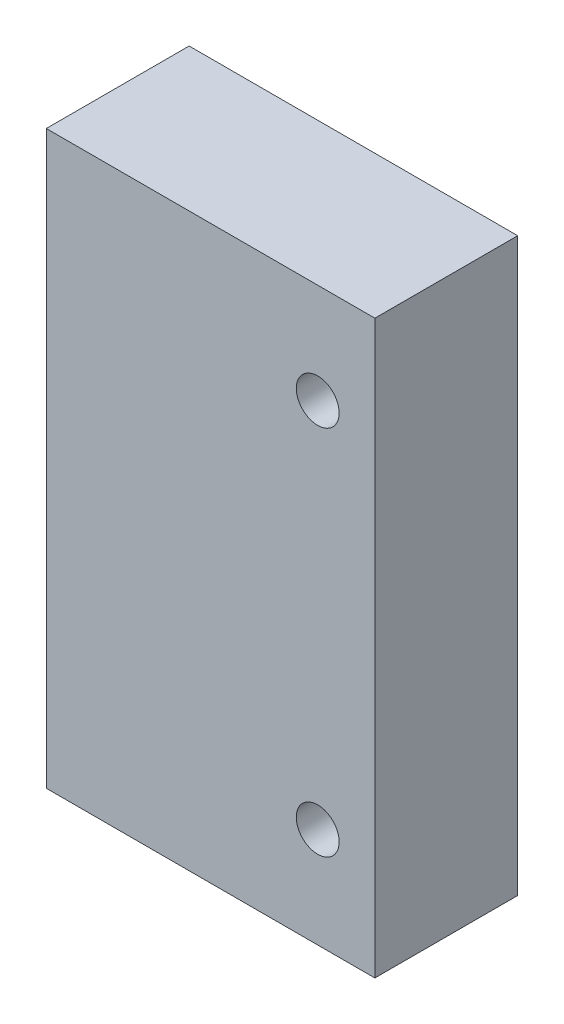
ISO-10303-21;
HEADER;
FILE_DESCRIPTION(('STEP AP214'),'2;1');
FILE_NAME('part.step','',(''),(''),'','','');
FILE_SCHEMA(('AUTOMOTIVE_DESIGN { 1 0 10303 214 1 1 1 1 }'));
ENDSEC;
DATA;
#1=APPLICATION_CONTEXT('core data for automotive mechanical design processes');
#2=APPLICATION_PROTOCOL_DEFINITION('international standard','automotive_design',2000,#1);
#3=PRODUCT_CONTEXT('',#1,'mechanical');
#4=PRODUCT('Part','Part','',(#3));
#5=PRODUCT_RELATED_PRODUCT_CATEGORY('part','',(#4));
#6=PRODUCT_DEFINITION_FORMATION('','',#4);
#7=PRODUCT_DEFINITION_CONTEXT('part definition',#1,'design');
#8=PRODUCT_DEFINITION('design','',#6,#7);
#9=PRODUCT_DEFINITION_SHAPE('','',#8);
#10=(LENGTH_UNIT() NAMED_UNIT(*) SI_UNIT(.MILLI.,.METRE.));
#11=(NAMED_UNIT(*) PLANE_ANGLE_UNIT() SI_UNIT($,.RADIAN.));
#12=(NAMED_UNIT(*) SI_UNIT($,.STERADIAN.) SOLID_ANGLE_UNIT());
#13=UNCERTAINTY_MEASURE_WITH_UNIT(LENGTH_MEASURE(1.E-05),#10,'distance_accuracy_value','');
#14=(GEOMETRIC_REPRESENTATION_CONTEXT(3) GLOBAL_UNCERTAINTY_ASSIGNED_CONTEXT((#13)) GLOBAL_UNIT_ASSIGNED_CONTEXT((#10,
#11,#12)) REPRESENTATION_CONTEXT('',''));
#15=CARTESIAN_POINT('',(0.,0.,0.));
#16=DIRECTION('',(0.,0.,1.));
#17=DIRECTION('',(1.,0.,0.));
#18=AXIS2_PLACEMENT_3D('',#15,#16,#17);
#19=CARTESIAN_POINT('',(0.,0.,10.));
#20=DIRECTION('',(0.,0.,1.));
#21=DIRECTION('',(1.,0.,0.));
#22=AXIS2_PLACEMENT_3D('',#19,#20,#21);
#23=PLANE('',#22);
#24=CARTESIAN_POINT('',(7.5,13.,10.));
#25=DIRECTION('',(0.,0.,1.));
#26=DIRECTION('',(1.,0.,0.));
#27=AXIS2_PLACEMENT_3D('',#24,#25,#26);
#28=CIRCLE('',#27,1.5);
#29=CARTESIAN_POINT('',(9.,13.,10.));
#30=VERTEX_POINT('',#29);
#31=EDGE_CURVE('E112',#30,#30,#28,.T.);
#32=ORIENTED_EDGE('',*,*,#31,.F.);
#33=EDGE_LOOP('',(#32));
#34=FACE_BOUND('',#33,.T.);
#35=DIRECTION('',(0.,1.,0.));
#36=VECTOR('',#35,1.);
#37=CARTESIAN_POINT('',(11.5,20.,10.));
#38=LINE('',#37,#36);
#39=CARTESIAN_POINT('',(11.5,-20.,10.));
#40=VERTEX_POINT('',#39);
#41=CARTESIAN_POINT('',(11.5,20.,10.));
#42=VERTEX_POINT('',#41);
#43=EDGE_CURVE('E92',#40,#42,#38,.T.);
#44=ORIENTED_EDGE('',*,*,#43,.T.);
#45=DIRECTION('',(-1.,0.,0.));
#46=VECTOR('',#45,1.);
#47=CARTESIAN_POINT('',(-11.5,20.,10.));
#48=LINE('',#47,#46);
#49=CARTESIAN_POINT('',(-11.5,20.,10.));
#50=VERTEX_POINT('',#49);
#51=EDGE_CURVE('E87',#42,#50,#48,.T.);
#52=ORIENTED_EDGE('',*,*,#51,.T.);
#53=DIRECTION('',(0.,-1.,0.));
#54=VECTOR('',#53,1.);
#55=CARTESIAN_POINT('',(-11.5,20.,10.));
#56=LINE('',#55,#54);
#57=CARTESIAN_POINT('',(-11.5,-20.,10.));
#58=VERTEX_POINT('',#57);
#59=EDGE_CURVE('E90',#50,#58,#56,.T.);
#60=ORIENTED_EDGE('',*,*,#59,.T.);
#61=DIRECTION('',(1.,0.,0.));
#62=VECTOR('',#61,1.);
#63=CARTESIAN_POINT('',(-11.5,-20.,10.));
#64=LINE('',#63,#62);
#65=EDGE_CURVE('E57',#58,#40,#64,.T.);
#66=ORIENTED_EDGE('',*,*,#65,.T.);
#67=EDGE_LOOP('',(#44,#52,#60,#66));
#68=FACE_BOUND('',#67,.T.);
#69=CARTESIAN_POINT('',(7.5,-13.,10.));
#70=DIRECTION('',(0.,0.,1.));
#71=DIRECTION('',(1.,0.,0.));
#72=AXIS2_PLACEMENT_3D('',#69,#70,#71);
#73=CIRCLE('',#72,1.5);
#74=CARTESIAN_POINT('',(9.,-13.,10.));
#75=VERTEX_POINT('',#74);
#76=EDGE_CURVE('E134',#75,#75,#73,.T.);
#77=ORIENTED_EDGE('',*,*,#76,.F.);
#78=EDGE_LOOP('',(#77));
#79=FACE_BOUND('',#78,.T.);
#80=ADVANCED_FACE('F39',(#34,#68,#79),#23,.T.);
#81=CARTESIAN_POINT('',(0.,0.,0.));
#82=DIRECTION('',(0.,0.,1.));
#83=DIRECTION('',(1.,0.,0.));
#84=AXIS2_PLACEMENT_3D('',#81,#82,#83);
#85=PLANE('',#84);
#86=DIRECTION('',(0.,1.,0.));
#87=VECTOR('',#86,1.);
#88=CARTESIAN_POINT('',(11.5,20.,0.));
#89=LINE('',#88,#87);
#90=CARTESIAN_POINT('',(11.5,-20.,0.));
#91=VERTEX_POINT('',#90);
#92=CARTESIAN_POINT('',(11.5,20.,0.));
#93=VERTEX_POINT('',#92);
#94=EDGE_CURVE('E108',#91,#93,#89,.T.);
#95=ORIENTED_EDGE('',*,*,#94,.F.);
#96=DIRECTION('',(1.,0.,0.));
#97=VECTOR('',#96,1.);
#98=CARTESIAN_POINT('',(-11.5,-20.,0.));
#99=LINE('',#98,#97);
#100=CARTESIAN_POINT('',(-11.5,-20.,0.));
#101=VERTEX_POINT('',#100);
#102=EDGE_CURVE('E80',#101,#91,#99,.T.);
#103=ORIENTED_EDGE('',*,*,#102,.F.);
#104=DIRECTION('',(0.,-1.,0.));
#105=VECTOR('',#104,1.);
#106=CARTESIAN_POINT('',(-11.5,20.,0.));
#107=LINE('',#106,#105);
#108=CARTESIAN_POINT('',(-11.5,20.,0.));
#109=VERTEX_POINT('',#108);
#110=EDGE_CURVE('E74',#109,#101,#107,.T.);
#111=ORIENTED_EDGE('',*,*,#110,.F.);
#112=DIRECTION('',(-1.,0.,0.));
#113=VECTOR('',#112,1.);
#114=CARTESIAN_POINT('',(-11.5,20.,0.));
#115=LINE('',#114,#113);
#116=EDGE_CURVE('E97',#93,#109,#115,.T.);
#117=ORIENTED_EDGE('',*,*,#116,.F.);
#118=EDGE_LOOP('',(#95,#103,#111,#117));
#119=FACE_BOUND('',#118,.T.);
#120=CARTESIAN_POINT('',(7.5,13.,0.));
#121=DIRECTION('',(0.,0.,1.));
#122=DIRECTION('',(1.,0.,0.));
#123=AXIS2_PLACEMENT_3D('',#120,#121,#122);
#124=CIRCLE('',#123,1.5);
#125=CARTESIAN_POINT('',(9.,13.,0.));
#126=VERTEX_POINT('',#125);
#127=EDGE_CURVE('E130',#126,#126,#124,.T.);
#128=ORIENTED_EDGE('',*,*,#127,.T.);
#129=EDGE_LOOP('',(#128));
#130=FACE_BOUND('',#129,.T.);
#131=CARTESIAN_POINT('',(7.5,-13.,0.));
#132=DIRECTION('',(0.,0.,1.));
#133=DIRECTION('',(1.,0.,0.));
#134=AXIS2_PLACEMENT_3D('',#131,#132,#133);
#135=CIRCLE('',#134,1.5);
#136=CARTESIAN_POINT('',(9.,-13.,0.));
#137=VERTEX_POINT('',#136);
#138=EDGE_CURVE('E138',#137,#137,#135,.T.);
#139=ORIENTED_EDGE('',*,*,#138,.T.);
#140=EDGE_LOOP('',(#139));
#141=FACE_BOUND('',#140,.T.);
#142=ADVANCED_FACE('F125',(#119,#130,#141),#85,.F.);
#143=CARTESIAN_POINT('',(11.5,20.,10.));
#144=DIRECTION('',(-1.,0.,0.));
#145=DIRECTION('',(0.,-1.,0.));
#146=AXIS2_PLACEMENT_3D('',#143,#144,#145);
#147=PLANE('',#146);
#148=ORIENTED_EDGE('',*,*,#94,.T.);
#149=DIRECTION('',(0.,0.,-1.));
#150=VECTOR('',#149,1.);
#151=CARTESIAN_POINT('',(11.5,20.,10.));
#152=LINE('',#151,#150);
#153=EDGE_CURVE('E11',#42,#93,#152,.T.);
#154=ORIENTED_EDGE('',*,*,#153,.F.);
#155=ORIENTED_EDGE('',*,*,#43,.F.);
#156=DIRECTION('',(0.,0.,-1.));
#157=VECTOR('',#156,1.);
#158=CARTESIAN_POINT('',(11.5,-20.,10.));
#159=LINE('',#158,#157);
#160=EDGE_CURVE('E104',#40,#91,#159,.T.);
#161=ORIENTED_EDGE('',*,*,#160,.T.);
#162=EDGE_LOOP('',(#148,#154,#155,#161));
#163=FACE_BOUND('',#162,.T.);
#164=ADVANCED_FACE('F41',(#163),#147,.F.);
#165=CARTESIAN_POINT('',(-11.5,20.,10.));
#166=DIRECTION('',(0.,-1.,0.));
#167=DIRECTION('',(0.,0.,-1.));
#168=AXIS2_PLACEMENT_3D('',#165,#166,#167);
#169=PLANE('',#168);
#170=ORIENTED_EDGE('',*,*,#116,.T.);
#171=DIRECTION('',(0.,0.,-1.));
#172=VECTOR('',#171,1.);
#173=CARTESIAN_POINT('',(-11.5,20.,10.));
#174=LINE('',#173,#172);
#175=EDGE_CURVE('E49',#50,#109,#174,.T.);
#176=ORIENTED_EDGE('',*,*,#175,.F.);
#177=ORIENTED_EDGE('',*,*,#51,.F.);
#178=ORIENTED_EDGE('',*,*,#153,.T.);
#179=EDGE_LOOP('',(#170,#176,#177,#178));
#180=FACE_BOUND('',#179,.T.);
#181=ADVANCED_FACE('F96',(#180),#169,.F.);
#182=CARTESIAN_POINT('',(-11.5,20.,10.));
#183=DIRECTION('',(1.,0.,0.));
#184=DIRECTION('',(0.,1.,0.));
#185=AXIS2_PLACEMENT_3D('',#182,#183,#184);
#186=PLANE('',#185);
#187=ORIENTED_EDGE('',*,*,#110,.T.);
#188=DIRECTION('',(0.,0.,-1.));
#189=VECTOR('',#188,1.);
#190=CARTESIAN_POINT('',(-11.5,-20.,10.));
#191=LINE('',#190,#189);
#192=EDGE_CURVE('E99',#58,#101,#191,.T.);
#193=ORIENTED_EDGE('',*,*,#192,.F.);
#194=ORIENTED_EDGE('',*,*,#59,.F.);
#195=ORIENTED_EDGE('',*,*,#175,.T.);
#196=EDGE_LOOP('',(#187,#193,#194,#195));
#197=FACE_BOUND('',#196,.T.);
#198=ADVANCED_FACE('F100',(#197),#186,.F.);
#199=CARTESIAN_POINT('',(-11.5,-20.,10.));
#200=DIRECTION('',(0.,1.,0.));
#201=DIRECTION('',(0.,0.,1.));
#202=AXIS2_PLACEMENT_3D('',#199,#200,#201);
#203=PLANE('',#202);
#204=ORIENTED_EDGE('',*,*,#102,.T.);
#205=ORIENTED_EDGE('',*,*,#160,.F.);
#206=ORIENTED_EDGE('',*,*,#65,.F.);
#207=ORIENTED_EDGE('',*,*,#192,.T.);
#208=EDGE_LOOP('',(#204,#205,#206,#207));
#209=FACE_BOUND('',#208,.T.);
#210=ADVANCED_FACE('F122',(#209),#203,.F.);
#211=CARTESIAN_POINT('',(7.5,13.,10.));
#212=DIRECTION('',(0.,0.,-1.));
#213=DIRECTION('',(-1.,0.,0.));
#214=AXIS2_PLACEMENT_3D('',#211,#212,#213);
#215=CYLINDRICAL_SURFACE('',#214,1.5);
#216=ORIENTED_EDGE('',*,*,#31,.T.);
#217=EDGE_LOOP('',(#216));
#218=FACE_BOUND('',#217,.T.);
#219=ORIENTED_EDGE('',*,*,#127,.F.);
#220=EDGE_LOOP('',(#219));
#221=FACE_BOUND('',#220,.T.);
#222=ADVANCED_FACE('F157',(#218,#221),#215,.F.);
#223=CARTESIAN_POINT('',(7.5,-13.,10.));
#224=DIRECTION('',(0.,0.,-1.));
#225=DIRECTION('',(-1.,0.,0.));
#226=AXIS2_PLACEMENT_3D('',#223,#224,#225);
#227=CYLINDRICAL_SURFACE('',#226,1.5);
#228=ORIENTED_EDGE('',*,*,#76,.T.);
#229=EDGE_LOOP('',(#228));
#230=FACE_BOUND('',#229,.T.);
#231=ORIENTED_EDGE('',*,*,#138,.F.);
#232=EDGE_LOOP('',(#231));
#233=FACE_BOUND('',#232,.T.);
#234=ADVANCED_FACE('F146',(#230,#233),#227,.F.);
#235=CLOSED_SHELL('',(#80,#142,#164,#181,#198,#210,#222,#234));
#236=MANIFOLD_SOLID_BREP('B2',#235);
#237=ADVANCED_BREP_SHAPE_REPRESENTATION('',(#18,#236),#14);
#238=SHAPE_DEFINITION_REPRESENTATION(#9,#237);
ENDSEC;
END-ISO-10303-21;
